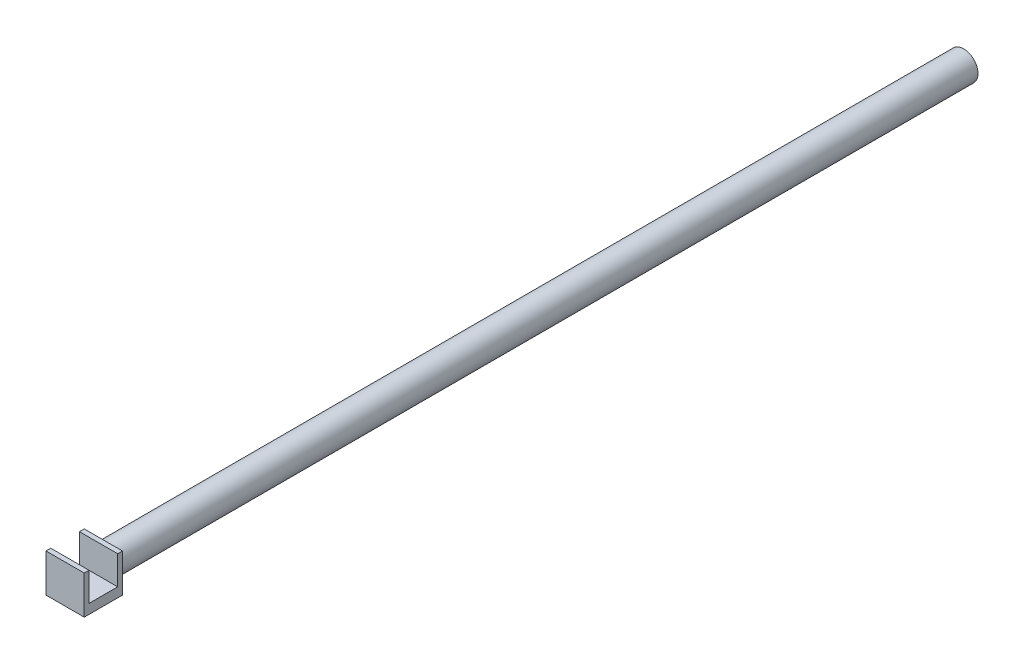
ISO-10303-21;
HEADER;
FILE_DESCRIPTION(('STEP AP214'),'2;1');
FILE_NAME('part.step','',(''),(''),'','','');
FILE_SCHEMA(('AUTOMOTIVE_DESIGN { 1 0 10303 214 1 1 1 1 }'));
ENDSEC;
DATA;
#1=APPLICATION_CONTEXT('core data for automotive mechanical design processes');
#2=APPLICATION_PROTOCOL_DEFINITION('international standard','automotive_design',2000,#1);
#3=PRODUCT_CONTEXT('',#1,'mechanical');
#4=PRODUCT('Part','Part','',(#3));
#5=PRODUCT_RELATED_PRODUCT_CATEGORY('part','',(#4));
#6=PRODUCT_DEFINITION_FORMATION('','',#4);
#7=PRODUCT_DEFINITION_CONTEXT('part definition',#1,'design');
#8=PRODUCT_DEFINITION('design','',#6,#7);
#9=PRODUCT_DEFINITION_SHAPE('','',#8);
#10=(LENGTH_UNIT() NAMED_UNIT(*) SI_UNIT(.MILLI.,.METRE.));
#11=(NAMED_UNIT(*) PLANE_ANGLE_UNIT() SI_UNIT($,.RADIAN.));
#12=(NAMED_UNIT(*) SI_UNIT($,.STERADIAN.) SOLID_ANGLE_UNIT());
#13=UNCERTAINTY_MEASURE_WITH_UNIT(LENGTH_MEASURE(1.E-05),#10,'distance_accuracy_value','');
#14=(GEOMETRIC_REPRESENTATION_CONTEXT(3) GLOBAL_UNCERTAINTY_ASSIGNED_CONTEXT((#13)) GLOBAL_UNIT_ASSIGNED_CONTEXT((#10,
#11,#12)) REPRESENTATION_CONTEXT('',''));
#15=CARTESIAN_POINT('',(0.,0.,0.));
#16=DIRECTION('',(0.,0.,1.));
#17=DIRECTION('',(1.,0.,0.));
#18=AXIS2_PLACEMENT_3D('',#15,#16,#17);
#19=CARTESIAN_POINT('',(10.,-7.5,-7.5));
#20=DIRECTION('',(0.,0.,-1.));
#21=DIRECTION('',(-1.,0.,0.));
#22=AXIS2_PLACEMENT_3D('',#19,#20,#21);
#23=PLANE('',#22);
#24=DIRECTION('',(0.,-1.,0.));
#25=VECTOR('',#24,1.);
#26=CARTESIAN_POINT('',(-10.,-7.5,-7.5));
#27=LINE('',#26,#25);
#28=CARTESIAN_POINT('',(-10.,7.5,-7.5));
#29=VERTEX_POINT('',#28);
#30=CARTESIAN_POINT('',(-10.,-7.5,-7.5));
#31=VERTEX_POINT('',#30);
#32=EDGE_CURVE('E136',#29,#31,#27,.T.);
#33=ORIENTED_EDGE('',*,*,#32,.T.);
#34=DIRECTION('',(-1.,0.,0.));
#35=VECTOR('',#34,1.);
#36=CARTESIAN_POINT('',(10.,-7.5,-7.5));
#37=LINE('',#36,#35);
#38=CARTESIAN_POINT('',(10.,-7.5,-7.5));
#39=VERTEX_POINT('',#38);
#40=EDGE_CURVE('E45',#39,#31,#37,.T.);
#41=ORIENTED_EDGE('',*,*,#40,.F.);
#42=DIRECTION('',(0.,-1.,0.));
#43=VECTOR('',#42,1.);
#44=CARTESIAN_POINT('',(10.,-7.5,-7.5));
#45=LINE('',#44,#43);
#46=CARTESIAN_POINT('',(10.,7.5,-7.5));
#47=VERTEX_POINT('',#46);
#48=EDGE_CURVE('E155',#47,#39,#45,.T.);
#49=ORIENTED_EDGE('',*,*,#48,.F.);
#50=DIRECTION('',(-1.,0.,0.));
#51=VECTOR('',#50,1.);
#52=CARTESIAN_POINT('',(10.,7.5,-7.5));
#53=LINE('',#52,#51);
#54=EDGE_CURVE('E135',#47,#29,#53,.T.);
#55=ORIENTED_EDGE('',*,*,#54,.T.);
#56=EDGE_LOOP('',(#33,#41,#49,#55));
#57=FACE_BOUND('',#56,.T.);
#58=ADVANCED_FACE('F39',(#57),#23,.F.);
#59=CARTESIAN_POINT('',(10.,-7.5,7.5));
#60=DIRECTION('',(0.,-1.,0.));
#61=DIRECTION('',(0.,0.,-1.));
#62=AXIS2_PLACEMENT_3D('',#59,#60,#61);
#63=PLANE('',#62);
#64=DIRECTION('',(0.,0.,1.));
#65=VECTOR('',#64,1.);
#66=CARTESIAN_POINT('',(-10.,-7.5,7.5));
#67=LINE('',#66,#65);
#68=CARTESIAN_POINT('',(-10.,-7.5,7.5));
#69=VERTEX_POINT('',#68);
#70=EDGE_CURVE('E137',#31,#69,#67,.T.);
#71=ORIENTED_EDGE('',*,*,#70,.T.);
#72=DIRECTION('',(-1.,0.,0.));
#73=VECTOR('',#72,1.);
#74=CARTESIAN_POINT('',(10.,-7.5,7.5));
#75=LINE('',#74,#73);
#76=CARTESIAN_POINT('',(10.,-7.5,7.5));
#77=VERTEX_POINT('',#76);
#78=EDGE_CURVE('E161',#77,#69,#75,.T.);
#79=ORIENTED_EDGE('',*,*,#78,.F.);
#80=DIRECTION('',(0.,0.,1.));
#81=VECTOR('',#80,1.);
#82=CARTESIAN_POINT('',(10.,-7.5,7.5));
#83=LINE('',#82,#81);
#84=EDGE_CURVE('E99',#39,#77,#83,.T.);
#85=ORIENTED_EDGE('',*,*,#84,.F.);
#86=ORIENTED_EDGE('',*,*,#40,.T.);
#87=EDGE_LOOP('',(#71,#79,#85,#86));
#88=FACE_BOUND('',#87,.T.);
#89=ADVANCED_FACE('F170',(#88),#63,.F.);
#90=CARTESIAN_POINT('',(10.,-7.5,7.5));
#91=DIRECTION('',(0.,0.,1.));
#92=DIRECTION('',(1.,0.,0.));
#93=AXIS2_PLACEMENT_3D('',#90,#91,#92);
#94=PLANE('',#93);
#95=DIRECTION('',(0.,1.,0.));
#96=VECTOR('',#95,1.);
#97=CARTESIAN_POINT('',(-10.,-7.5,7.5));
#98=LINE('',#97,#96);
#99=CARTESIAN_POINT('',(-10.,7.5,7.5));
#100=VERTEX_POINT('',#99);
#101=EDGE_CURVE('E141',#69,#100,#98,.T.);
#102=ORIENTED_EDGE('',*,*,#101,.T.);
#103=DIRECTION('',(-1.,0.,0.));
#104=VECTOR('',#103,1.);
#105=CARTESIAN_POINT('',(10.,7.5,7.5));
#106=LINE('',#105,#104);
#107=CARTESIAN_POINT('',(10.,7.5,7.5));
#108=VERTEX_POINT('',#107);
#109=EDGE_CURVE('E157',#108,#100,#106,.T.);
#110=ORIENTED_EDGE('',*,*,#109,.F.);
#111=DIRECTION('',(0.,1.,0.));
#112=VECTOR('',#111,1.);
#113=CARTESIAN_POINT('',(10.,-7.5,7.5));
#114=LINE('',#113,#112);
#115=EDGE_CURVE('E185',#77,#108,#114,.T.);
#116=ORIENTED_EDGE('',*,*,#115,.F.);
#117=ORIENTED_EDGE('',*,*,#78,.T.);
#118=EDGE_LOOP('',(#102,#110,#116,#117));
#119=FACE_BOUND('',#118,.T.);
#120=ADVANCED_FACE('F179',(#119),#94,.F.);
#121=CARTESIAN_POINT('',(10.,7.5,9.99999999999907));
#122=DIRECTION('',(0.,-1.,0.));
#123=DIRECTION('',(0.,0.,-1.));
#124=AXIS2_PLACEMENT_3D('',#121,#122,#123);
#125=PLANE('',#124);
#126=DIRECTION('',(0.,0.,1.));
#127=VECTOR('',#126,1.);
#128=CARTESIAN_POINT('',(-10.,7.5,9.99999999999907));
#129=LINE('',#128,#127);
#130=CARTESIAN_POINT('',(-10.,7.5,9.99999999999907));
#131=VERTEX_POINT('',#130);
#132=EDGE_CURVE('E144',#100,#131,#129,.T.);
#133=ORIENTED_EDGE('',*,*,#132,.T.);
#134=DIRECTION('',(-1.,0.,0.));
#135=VECTOR('',#134,1.);
#136=CARTESIAN_POINT('',(10.,7.5,9.99999999999907));
#137=LINE('',#136,#135);
#138=CARTESIAN_POINT('',(10.,7.5,9.99999999999907));
#139=VERTEX_POINT('',#138);
#140=EDGE_CURVE('E156',#139,#131,#137,.T.);
#141=ORIENTED_EDGE('',*,*,#140,.F.);
#142=DIRECTION('',(0.,0.,1.));
#143=VECTOR('',#142,1.);
#144=CARTESIAN_POINT('',(10.,7.5,9.99999999999907));
#145=LINE('',#144,#143);
#146=EDGE_CURVE('E182',#108,#139,#145,.T.);
#147=ORIENTED_EDGE('',*,*,#146,.F.);
#148=ORIENTED_EDGE('',*,*,#109,.T.);
#149=EDGE_LOOP('',(#133,#141,#147,#148));
#150=FACE_BOUND('',#149,.T.);
#151=ADVANCED_FACE('F178',(#150),#125,.F.);
#152=CARTESIAN_POINT('',(10.,7.5,9.99999999999907));
#153=DIRECTION('',(0.,0.,-1.));
#154=DIRECTION('',(0.,1.,0.));
#155=AXIS2_PLACEMENT_3D('',#152,#153,#154);
#156=PLANE('',#155);
#157=DIRECTION('',(0.,-1.,0.));
#158=VECTOR('',#157,1.);
#159=CARTESIAN_POINT('',(-10.,7.5,9.99999999999907));
#160=LINE('',#159,#158);
#161=CARTESIAN_POINT('',(-10.,-12.5,10.));
#162=VERTEX_POINT('',#161);
#163=EDGE_CURVE('E150',#131,#162,#160,.T.);
#164=ORIENTED_EDGE('',*,*,#163,.T.);
#165=DIRECTION('',(-1.,0.,0.));
#166=VECTOR('',#165,1.);
#167=CARTESIAN_POINT('',(10.,-12.5,10.));
#168=LINE('',#167,#166);
#169=CARTESIAN_POINT('',(10.,-12.5,10.));
#170=VERTEX_POINT('',#169);
#171=EDGE_CURVE('E126',#170,#162,#168,.T.);
#172=ORIENTED_EDGE('',*,*,#171,.F.);
#173=DIRECTION('',(0.,-1.,0.));
#174=VECTOR('',#173,1.);
#175=CARTESIAN_POINT('',(10.,7.5,9.99999999999907));
#176=LINE('',#175,#174);
#177=EDGE_CURVE('E118',#139,#170,#176,.T.);
#178=ORIENTED_EDGE('',*,*,#177,.F.);
#179=ORIENTED_EDGE('',*,*,#140,.T.);
#180=EDGE_LOOP('',(#164,#172,#178,#179));
#181=FACE_BOUND('',#180,.T.);
#182=ADVANCED_FACE('F208',(#181),#156,.F.);
#183=CARTESIAN_POINT('',(10.,-12.5,10.));
#184=DIRECTION('',(0.,1.,0.));
#185=DIRECTION('',(0.,0.,1.));
#186=AXIS2_PLACEMENT_3D('',#183,#184,#185);
#187=PLANE('',#186);
#188=DIRECTION('',(0.,0.,-1.));
#189=VECTOR('',#188,1.);
#190=CARTESIAN_POINT('',(-10.,-12.5,10.));
#191=LINE('',#190,#189);
#192=CARTESIAN_POINT('',(-10.,-12.5,-10.));
#193=VERTEX_POINT('',#192);
#194=EDGE_CURVE('E130',#162,#193,#191,.T.);
#195=ORIENTED_EDGE('',*,*,#194,.T.);
#196=DIRECTION('',(-1.,0.,0.));
#197=VECTOR('',#196,1.);
#198=CARTESIAN_POINT('',(10.,-12.5,-10.));
#199=LINE('',#198,#197);
#200=CARTESIAN_POINT('',(10.,-12.5,-10.));
#201=VERTEX_POINT('',#200);
#202=EDGE_CURVE('E123',#201,#193,#199,.T.);
#203=ORIENTED_EDGE('',*,*,#202,.F.);
#204=DIRECTION('',(0.,0.,-1.));
#205=VECTOR('',#204,1.);
#206=CARTESIAN_POINT('',(10.,-12.5,10.));
#207=LINE('',#206,#205);
#208=EDGE_CURVE('E114',#170,#201,#207,.T.);
#209=ORIENTED_EDGE('',*,*,#208,.F.);
#210=ORIENTED_EDGE('',*,*,#171,.T.);
#211=EDGE_LOOP('',(#195,#203,#209,#210));
#212=FACE_BOUND('',#211,.T.);
#213=ADVANCED_FACE('F122',(#212),#187,.F.);
#214=CARTESIAN_POINT('',(10.,7.5,-9.99999999999907));
#215=DIRECTION('',(0.,0.,1.));
#216=DIRECTION('',(0.,-1.,0.));
#217=AXIS2_PLACEMENT_3D('',#214,#215,#216);
#218=PLANE('',#217);
#219=CARTESIAN_POINT('',(0.,-2.50000000000015,-9.99999999999953));
#220=DIRECTION('',(0.,0.,-1.));
#221=DIRECTION('',(0.,1.,0.));
#222=AXIS2_PLACEMENT_3D('',#219,#220,#221);
#223=CIRCLE('',#222,7.5);
#224=CARTESIAN_POINT('',(0.,4.99999999999985,-9.99999999999919));
#225=VERTEX_POINT('',#224);
#226=EDGE_CURVE('E11',#225,#225,#223,.T.);
#227=ORIENTED_EDGE('',*,*,#226,.F.);
#228=EDGE_LOOP('',(#227));
#229=FACE_BOUND('',#228,.T.);
#230=DIRECTION('',(0.,1.,0.));
#231=VECTOR('',#230,1.);
#232=CARTESIAN_POINT('',(-10.,7.5,-9.99999999999907));
#233=LINE('',#232,#231);
#234=CARTESIAN_POINT('',(-10.,7.5,-9.99999999999907));
#235=VERTEX_POINT('',#234);
#236=EDGE_CURVE('E82',#193,#235,#233,.T.);
#237=ORIENTED_EDGE('',*,*,#236,.T.);
#238=DIRECTION('',(-1.,0.,0.));
#239=VECTOR('',#238,1.);
#240=CARTESIAN_POINT('',(10.,7.5,-9.99999999999907));
#241=LINE('',#240,#239);
#242=CARTESIAN_POINT('',(10.,7.5,-9.99999999999907));
#243=VERTEX_POINT('',#242);
#244=EDGE_CURVE('E129',#243,#235,#241,.T.);
#245=ORIENTED_EDGE('',*,*,#244,.F.);
#246=DIRECTION('',(0.,1.,0.));
#247=VECTOR('',#246,1.);
#248=CARTESIAN_POINT('',(10.,7.5,-9.99999999999907));
#249=LINE('',#248,#247);
#250=EDGE_CURVE('E116',#201,#243,#249,.T.);
#251=ORIENTED_EDGE('',*,*,#250,.F.);
#252=ORIENTED_EDGE('',*,*,#202,.T.);
#253=EDGE_LOOP('',(#237,#245,#251,#252));
#254=FACE_BOUND('',#253,.T.);
#255=ADVANCED_FACE('F134',(#229,#254),#218,.F.);
#256=CARTESIAN_POINT('',(10.,7.5,-7.5));
#257=DIRECTION('',(0.,-1.,0.));
#258=DIRECTION('',(0.,0.,-1.));
#259=AXIS2_PLACEMENT_3D('',#256,#257,#258);
#260=PLANE('',#259);
#261=DIRECTION('',(0.,0.,1.));
#262=VECTOR('',#261,1.);
#263=CARTESIAN_POINT('',(-10.,7.5,-7.5));
#264=LINE('',#263,#262);
#265=EDGE_CURVE('E93',#235,#29,#264,.T.);
#266=ORIENTED_EDGE('',*,*,#265,.T.);
#267=ORIENTED_EDGE('',*,*,#54,.F.);
#268=DIRECTION('',(0.,0.,1.));
#269=VECTOR('',#268,1.);
#270=CARTESIAN_POINT('',(10.,7.5,-7.5));
#271=LINE('',#270,#269);
#272=EDGE_CURVE('E57',#243,#47,#271,.T.);
#273=ORIENTED_EDGE('',*,*,#272,.F.);
#274=ORIENTED_EDGE('',*,*,#244,.T.);
#275=EDGE_LOOP('',(#266,#267,#273,#274));
#276=FACE_BOUND('',#275,.T.);
#277=ADVANCED_FACE('F199',(#276),#260,.F.);
#278=CARTESIAN_POINT('',(10.,0.,0.));
#279=DIRECTION('',(-1.,0.,0.));
#280=DIRECTION('',(0.,0.,1.));
#281=AXIS2_PLACEMENT_3D('',#278,#279,#280);
#282=PLANE('',#281);
#283=ORIENTED_EDGE('',*,*,#48,.T.);
#284=ORIENTED_EDGE('',*,*,#84,.T.);
#285=ORIENTED_EDGE('',*,*,#115,.T.);
#286=ORIENTED_EDGE('',*,*,#146,.T.);
#287=ORIENTED_EDGE('',*,*,#177,.T.);
#288=ORIENTED_EDGE('',*,*,#208,.T.);
#289=ORIENTED_EDGE('',*,*,#250,.T.);
#290=ORIENTED_EDGE('',*,*,#272,.T.);
#291=EDGE_LOOP('',(#283,#284,#285,#286,#287,#288,#289,#290));
#292=FACE_BOUND('',#291,.T.);
#293=ADVANCED_FACE('F113',(#292),#282,.F.);
#294=CARTESIAN_POINT('',(-10.,0.,0.));
#295=DIRECTION('',(-1.,0.,0.));
#296=DIRECTION('',(0.,0.,1.));
#297=AXIS2_PLACEMENT_3D('',#294,#295,#296);
#298=PLANE('',#297);
#299=ORIENTED_EDGE('',*,*,#32,.F.);
#300=ORIENTED_EDGE('',*,*,#265,.F.);
#301=ORIENTED_EDGE('',*,*,#236,.F.);
#302=ORIENTED_EDGE('',*,*,#194,.F.);
#303=ORIENTED_EDGE('',*,*,#163,.F.);
#304=ORIENTED_EDGE('',*,*,#132,.F.);
#305=ORIENTED_EDGE('',*,*,#101,.F.);
#306=ORIENTED_EDGE('',*,*,#70,.F.);
#307=EDGE_LOOP('',(#299,#300,#301,#302,#303,#304,#305,#306));
#308=FACE_BOUND('',#307,.T.);
#309=ADVANCED_FACE('F171',(#308),#298,.T.);
#310=CARTESIAN_POINT('',(0.,-2.49999999997923,-460.));
#311=DIRECTION('',(0.,0.,1.));
#312=DIRECTION('',(0.,-1.,0.));
#313=AXIS2_PLACEMENT_3D('',#310,#311,#312);
#314=CYLINDRICAL_SURFACE('',#313,7.5);
#315=CARTESIAN_POINT('',(0.,-2.49999999997923,-460.));
#316=DIRECTION('',(0.,0.,-1.));
#317=DIRECTION('',(0.,1.,0.));
#318=AXIS2_PLACEMENT_3D('',#315,#316,#317);
#319=CIRCLE('',#318,7.5);
#320=CARTESIAN_POINT('',(0.,5.00000000002077,-459.999999999999));
#321=VERTEX_POINT('',#320);
#322=EDGE_CURVE('E143',#321,#321,#319,.T.);
#323=ORIENTED_EDGE('',*,*,#322,.F.);
#324=EDGE_LOOP('',(#323));
#325=FACE_BOUND('',#324,.T.);
#326=ORIENTED_EDGE('',*,*,#226,.T.);
#327=EDGE_LOOP('',(#326));
#328=FACE_BOUND('',#327,.T.);
#329=ADVANCED_FACE('F195',(#325,#328),#314,.T.);
#330=CARTESIAN_POINT('',(0.,-2.49999999997923,-460.));
#331=DIRECTION('',(0.,0.,-1.));
#332=DIRECTION('',(0.,1.,0.));
#333=AXIS2_PLACEMENT_3D('',#330,#331,#332);
#334=PLANE('',#333);
#335=ORIENTED_EDGE('',*,*,#322,.T.);
#336=EDGE_LOOP('',(#335));
#337=FACE_BOUND('',#336,.T.);
#338=ADVANCED_FACE('F194',(#337),#334,.T.);
#339=CLOSED_SHELL('',(#58,#89,#120,#151,#182,#213,#255,#277,#293,#309,#329,#338));
#340=MANIFOLD_SOLID_BREP('B2',#339);
#341=ADVANCED_BREP_SHAPE_REPRESENTATION('',(#18,#340),#14);
#342=SHAPE_DEFINITION_REPRESENTATION(#9,#341);
ENDSEC;
END-ISO-10303-21;
